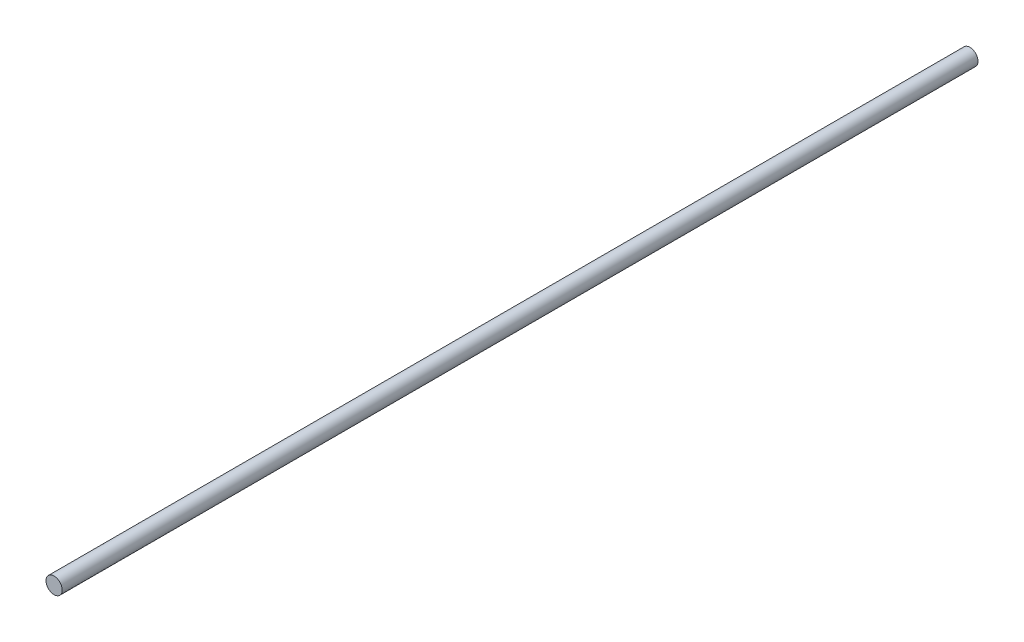
ISO-10303-21;
HEADER;
FILE_DESCRIPTION(('STEP AP214'),'2;1');
FILE_NAME('part.step','',(''),(''),'','','');
FILE_SCHEMA(('AUTOMOTIVE_DESIGN { 1 0 10303 214 1 1 1 1 }'));
ENDSEC;
DATA;
#1=APPLICATION_CONTEXT('core data for automotive mechanical design processes');
#2=APPLICATION_PROTOCOL_DEFINITION('international standard','automotive_design',2000,#1);
#3=PRODUCT_CONTEXT('',#1,'mechanical');
#4=PRODUCT('Part','Part','',(#3));
#5=PRODUCT_RELATED_PRODUCT_CATEGORY('part','',(#4));
#6=PRODUCT_DEFINITION_FORMATION('','',#4);
#7=PRODUCT_DEFINITION_CONTEXT('part definition',#1,'design');
#8=PRODUCT_DEFINITION('design','',#6,#7);
#9=PRODUCT_DEFINITION_SHAPE('','',#8);
#10=(LENGTH_UNIT() NAMED_UNIT(*) SI_UNIT(.MILLI.,.METRE.));
#11=(NAMED_UNIT(*) PLANE_ANGLE_UNIT() SI_UNIT($,.RADIAN.));
#12=(NAMED_UNIT(*) SI_UNIT($,.STERADIAN.) SOLID_ANGLE_UNIT());
#13=UNCERTAINTY_MEASURE_WITH_UNIT(LENGTH_MEASURE(1.E-05),#10,'distance_accuracy_value','');
#14=(GEOMETRIC_REPRESENTATION_CONTEXT(3) GLOBAL_UNCERTAINTY_ASSIGNED_CONTEXT((#13)) GLOBAL_UNIT_ASSIGNED_CONTEXT((#10,
#11,#12)) REPRESENTATION_CONTEXT('',''));
#15=CARTESIAN_POINT('',(0.,0.,0.));
#16=DIRECTION('',(0.,0.,1.));
#17=DIRECTION('',(1.,0.,0.));
#18=AXIS2_PLACEMENT_3D('',#15,#16,#17);
#19=CARTESIAN_POINT('',(0.,0.,282.5));
#20=DIRECTION('',(0.,0.,-1.));
#21=DIRECTION('',(-1.,0.,0.));
#22=AXIS2_PLACEMENT_3D('',#19,#20,#21);
#23=CYLINDRICAL_SURFACE('',#22,5.);
#24=CARTESIAN_POINT('',(0.,0.,282.5));
#25=DIRECTION('',(0.,0.,1.));
#26=DIRECTION('',(1.,0.,0.));
#27=AXIS2_PLACEMENT_3D('',#24,#25,#26);
#28=CIRCLE('',#27,5.);
#29=CARTESIAN_POINT('',(5.,0.,282.5));
#30=VERTEX_POINT('',#29);
#31=EDGE_CURVE('E10',#30,#30,#28,.T.);
#32=ORIENTED_EDGE('',*,*,#31,.F.);
#33=EDGE_LOOP('',(#32));
#34=FACE_BOUND('',#33,.T.);
#35=CARTESIAN_POINT('',(0.,0.,-282.5));
#36=DIRECTION('',(0.,0.,1.));
#37=DIRECTION('',(1.,0.,0.));
#38=AXIS2_PLACEMENT_3D('',#35,#36,#37);
#39=CIRCLE('',#38,5.);
#40=CARTESIAN_POINT('',(5.,0.,-282.5));
#41=VERTEX_POINT('',#40);
#42=EDGE_CURVE('E40',#41,#41,#39,.T.);
#43=ORIENTED_EDGE('',*,*,#42,.T.);
#44=EDGE_LOOP('',(#43));
#45=FACE_BOUND('',#44,.T.);
#46=ADVANCED_FACE('F37',(#34,#45),#23,.T.);
#47=CARTESIAN_POINT('',(0.,0.,282.5));
#48=DIRECTION('',(0.,0.,1.));
#49=DIRECTION('',(1.,0.,0.));
#50=AXIS2_PLACEMENT_3D('',#47,#48,#49);
#51=PLANE('',#50);
#52=ORIENTED_EDGE('',*,*,#31,.T.);
#53=EDGE_LOOP('',(#52));
#54=FACE_BOUND('',#53,.T.);
#55=ADVANCED_FACE('F54',(#54),#51,.T.);
#56=CARTESIAN_POINT('',(0.,0.,-282.5));
#57=DIRECTION('',(0.,0.,1.));
#58=DIRECTION('',(1.,0.,0.));
#59=AXIS2_PLACEMENT_3D('',#56,#57,#58);
#60=PLANE('',#59);
#61=ORIENTED_EDGE('',*,*,#42,.F.);
#62=EDGE_LOOP('',(#61));
#63=FACE_BOUND('',#62,.T.);
#64=ADVANCED_FACE('F52',(#63),#60,.F.);
#65=CLOSED_SHELL('',(#46,#55,#64));
#66=MANIFOLD_SOLID_BREP('B2',#65);
#67=ADVANCED_BREP_SHAPE_REPRESENTATION('',(#18,#66),#14);
#68=SHAPE_DEFINITION_REPRESENTATION(#9,#67);
ENDSEC;
END-ISO-10303-21;
